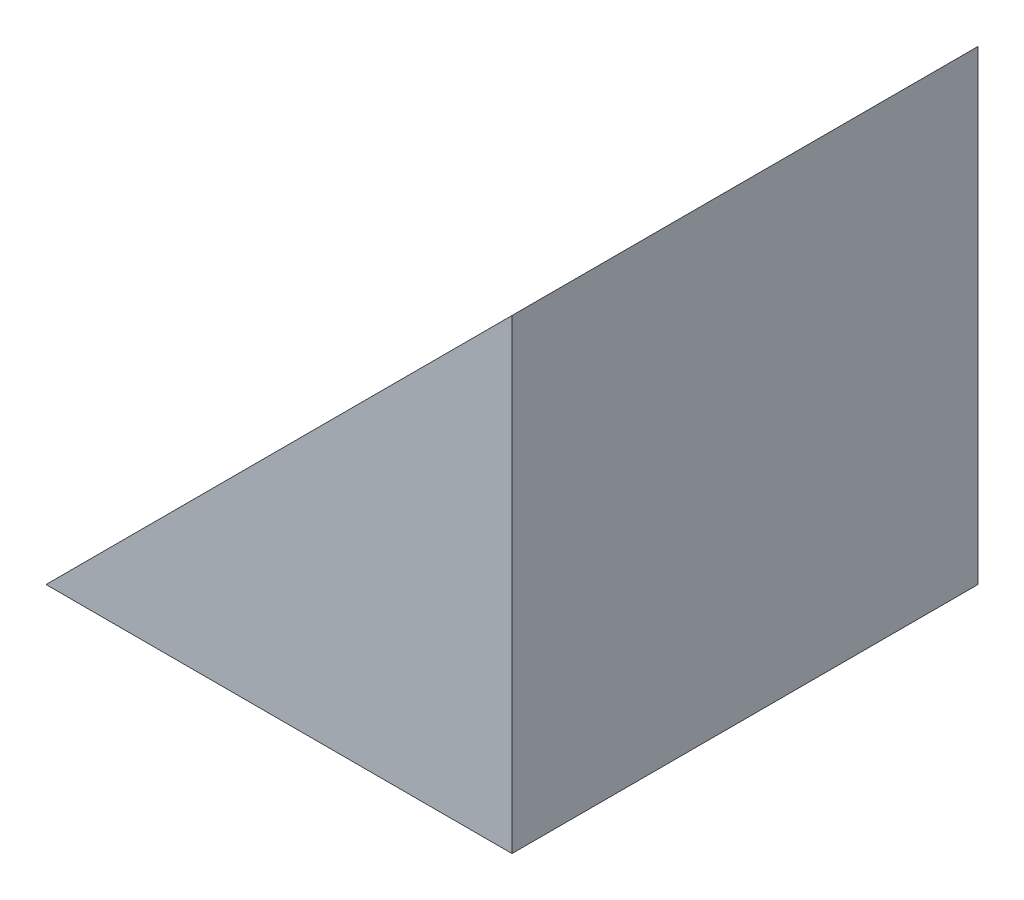
ISO-10303-21;
HEADER;
FILE_DESCRIPTION(('STEP AP214'),'2;1');
FILE_NAME('part.step','',(''),(''),'','','');
FILE_SCHEMA(('AUTOMOTIVE_DESIGN { 1 0 10303 214 1 1 1 1 }'));
ENDSEC;
DATA;
#1=APPLICATION_CONTEXT('core data for automotive mechanical design processes');
#2=APPLICATION_PROTOCOL_DEFINITION('international standard','automotive_design',2000,#1);
#3=PRODUCT_CONTEXT('',#1,'mechanical');
#4=PRODUCT('Part','Part','',(#3));
#5=PRODUCT_RELATED_PRODUCT_CATEGORY('part','',(#4));
#6=PRODUCT_DEFINITION_FORMATION('','',#4);
#7=PRODUCT_DEFINITION_CONTEXT('part definition',#1,'design');
#8=PRODUCT_DEFINITION('design','',#6,#7);
#9=PRODUCT_DEFINITION_SHAPE('','',#8);
#10=(LENGTH_UNIT() NAMED_UNIT(*) SI_UNIT(.MILLI.,.METRE.));
#11=(NAMED_UNIT(*) PLANE_ANGLE_UNIT() SI_UNIT($,.RADIAN.));
#12=(NAMED_UNIT(*) SI_UNIT($,.STERADIAN.) SOLID_ANGLE_UNIT());
#13=UNCERTAINTY_MEASURE_WITH_UNIT(LENGTH_MEASURE(1.E-05),#10,'distance_accuracy_value','');
#14=(GEOMETRIC_REPRESENTATION_CONTEXT(3) GLOBAL_UNCERTAINTY_ASSIGNED_CONTEXT((#13)) GLOBAL_UNIT_ASSIGNED_CONTEXT((#10,
#11,#12)) REPRESENTATION_CONTEXT('',''));
#15=CARTESIAN_POINT('',(0.,0.,0.));
#16=DIRECTION('',(0.,0.,1.));
#17=DIRECTION('',(1.,0.,0.));
#18=AXIS2_PLACEMENT_3D('',#15,#16,#17);
#19=CARTESIAN_POINT('',(-2.66144845527671,-41.6390849562708,2.));
#20=DIRECTION('',(-1.,0.,0.));
#21=DIRECTION('',(0.,-1.,0.));
#22=AXIS2_PLACEMENT_3D('',#19,#20,#21);
#23=PLANE('',#22);
#24=DIRECTION('',(0.,1.,0.));
#25=VECTOR('',#24,1.);
#26=CARTESIAN_POINT('',(-2.66144845527671,-41.6390849562708,0.));
#27=LINE('',#26,#25);
#28=CARTESIAN_POINT('',(-2.66144845527671,-43.6390849562708,0.));
#29=VERTEX_POINT('',#28);
#30=CARTESIAN_POINT('',(-2.66144845527671,-41.6390849562708,0.));
#31=VERTEX_POINT('',#30);
#32=EDGE_CURVE('E81',#29,#31,#27,.T.);
#33=ORIENTED_EDGE('',*,*,#32,.T.);
#34=DIRECTION('',(0.,0.,-1.));
#35=VECTOR('',#34,1.);
#36=CARTESIAN_POINT('',(-2.66144845527671,-41.6390849562708,2.));
#37=LINE('',#36,#35);
#38=CARTESIAN_POINT('',(-2.66144845527667,-41.6390849562708,2.));
#39=VERTEX_POINT('',#38);
#40=EDGE_CURVE('E11',#39,#31,#37,.T.);
#41=ORIENTED_EDGE('',*,*,#40,.F.);
#42=DIRECTION('',(0.,1.,0.));
#43=VECTOR('',#42,1.);
#44=CARTESIAN_POINT('',(-2.66144845527671,-41.6390849562708,2.));
#45=LINE('',#44,#43);
#46=CARTESIAN_POINT('',(-2.66144845527671,-43.6390849562708,2.));
#47=VERTEX_POINT('',#46);
#48=EDGE_CURVE('E72',#47,#39,#45,.T.);
#49=ORIENTED_EDGE('',*,*,#48,.F.);
#50=DIRECTION('',(0.,0.,-1.));
#51=VECTOR('',#50,1.);
#52=CARTESIAN_POINT('',(-2.66144845527671,-43.6390849562708,2.));
#53=LINE('',#52,#51);
#54=EDGE_CURVE('E69',#47,#29,#53,.T.);
#55=ORIENTED_EDGE('',*,*,#54,.T.);
#56=EDGE_LOOP('',(#33,#41,#49,#55));
#57=FACE_BOUND('',#56,.T.);
#58=ADVANCED_FACE('F32',(#57),#23,.F.);
#59=CARTESIAN_POINT('',(-4.66144845527671,-43.6390849562708,2.));
#60=DIRECTION('',(0.,1.,0.));
#61=DIRECTION('',(0.,0.,1.));
#62=AXIS2_PLACEMENT_3D('',#59,#60,#61);
#63=PLANE('',#62);
#64=DIRECTION('',(1.,0.,0.));
#65=VECTOR('',#64,1.);
#66=CARTESIAN_POINT('',(-4.66144845527671,-43.6390849562708,0.));
#67=LINE('',#66,#65);
#68=CARTESIAN_POINT('',(-4.66144845527671,-43.6390849562708,0.));
#69=VERTEX_POINT('',#68);
#70=EDGE_CURVE('E78',#69,#29,#67,.T.);
#71=ORIENTED_EDGE('',*,*,#70,.T.);
#72=ORIENTED_EDGE('',*,*,#54,.F.);
#73=DIRECTION('',(1.,0.,0.));
#74=VECTOR('',#73,1.);
#75=CARTESIAN_POINT('',(-4.66144845527671,-43.6390849562708,2.));
#76=LINE('',#75,#74);
#77=CARTESIAN_POINT('',(-4.66144845527671,-43.6390849562708,2.));
#78=VERTEX_POINT('',#77);
#79=EDGE_CURVE('E47',#78,#47,#76,.T.);
#80=ORIENTED_EDGE('',*,*,#79,.F.);
#81=DIRECTION('',(0.,0.,-1.));
#82=VECTOR('',#81,1.);
#83=CARTESIAN_POINT('',(-4.66144845527671,-43.6390849562708,2.));
#84=LINE('',#83,#82);
#85=EDGE_CURVE('E40',#78,#69,#84,.T.);
#86=ORIENTED_EDGE('',*,*,#85,.T.);
#87=EDGE_LOOP('',(#71,#72,#80,#86));
#88=FACE_BOUND('',#87,.T.);
#89=ADVANCED_FACE('F74',(#88),#63,.F.);
#90=CARTESIAN_POINT('',(0.,0.,2.));
#91=DIRECTION('',(0.,0.,1.));
#92=DIRECTION('',(1.,0.,0.));
#93=AXIS2_PLACEMENT_3D('',#90,#91,#92);
#94=PLANE('',#93);
#95=DIRECTION('',(0.707106781186554,0.707106781186541,0.));
#96=VECTOR('',#95,1.);
#97=CARTESIAN_POINT('',(-4.66144845527671,-43.6390849562708,2.));
#98=LINE('',#97,#96);
#99=EDGE_CURVE('E66',#78,#39,#98,.T.);
#100=ORIENTED_EDGE('',*,*,#99,.F.);
#101=ORIENTED_EDGE('',*,*,#79,.T.);
#102=ORIENTED_EDGE('',*,*,#48,.T.);
#103=EDGE_LOOP('',(#100,#101,#102));
#104=FACE_BOUND('',#103,.T.);
#105=ADVANCED_FACE('F70',(#104),#94,.T.);
#106=CARTESIAN_POINT('',(0.,0.,0.));
#107=DIRECTION('',(0.,0.,1.));
#108=DIRECTION('',(1.,0.,0.));
#109=AXIS2_PLACEMENT_3D('',#106,#107,#108);
#110=PLANE('',#109);
#111=ORIENTED_EDGE('',*,*,#70,.F.);
#112=DIRECTION('',(0.707106781186554,0.707106781186541,0.));
#113=VECTOR('',#112,1.);
#114=CARTESIAN_POINT('',(-4.66144845527671,-43.6390849562708,0.));
#115=LINE('',#114,#113);
#116=EDGE_CURVE('E62',#69,#31,#115,.T.);
#117=ORIENTED_EDGE('',*,*,#116,.T.);
#118=ORIENTED_EDGE('',*,*,#32,.F.);
#119=EDGE_LOOP('',(#111,#117,#118));
#120=FACE_BOUND('',#119,.T.);
#121=ADVANCED_FACE('F87',(#120),#110,.F.);
#122=CARTESIAN_POINT('',(-4.66144845527671,-43.6390849562708,0.));
#123=DIRECTION('',(0.707106781186541,-0.707106781186554,0.));
#124=DIRECTION('',(0.707106781186554,0.707106781186541,0.));
#125=AXIS2_PLACEMENT_3D('',#122,#123,#124);
#126=PLANE('',#125);
#127=ORIENTED_EDGE('',*,*,#99,.T.);
#128=ORIENTED_EDGE('',*,*,#40,.T.);
#129=ORIENTED_EDGE('',*,*,#116,.F.);
#130=ORIENTED_EDGE('',*,*,#85,.F.);
#131=EDGE_LOOP('',(#127,#128,#129,#130));
#132=FACE_BOUND('',#131,.T.);
#133=ADVANCED_FACE('F65',(#132),#126,.F.);
#134=CLOSED_SHELL('',(#58,#89,#105,#121,#133));
#135=MANIFOLD_SOLID_BREP('B2',#134);
#136=ADVANCED_BREP_SHAPE_REPRESENTATION('',(#18,#135),#14);
#137=SHAPE_DEFINITION_REPRESENTATION(#9,#136);
ENDSEC;
END-ISO-10303-21;
